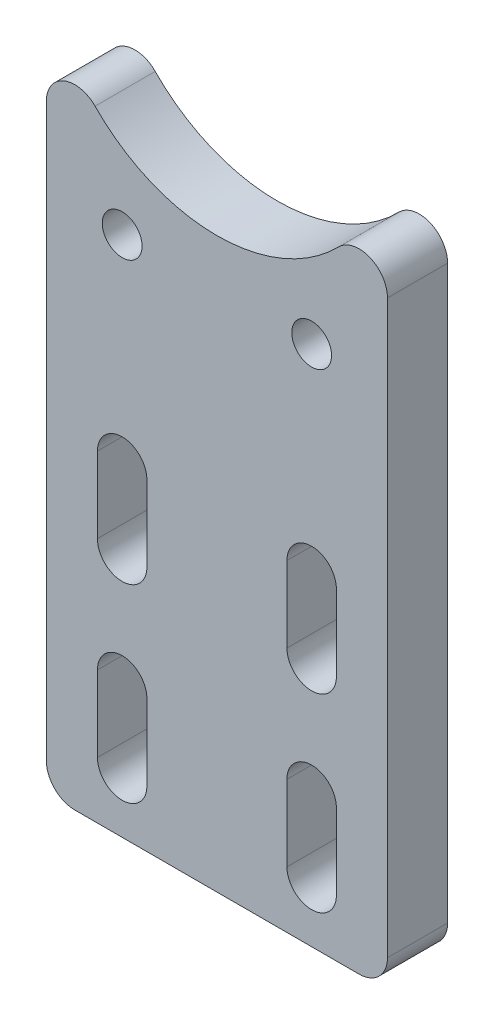
ISO-10303-21;
HEADER;
FILE_DESCRIPTION(('STEP AP214'),'2;1');
FILE_NAME('part.step','',(''),(''),'','','');
FILE_SCHEMA(('AUTOMOTIVE_DESIGN { 1 0 10303 214 1 1 1 1 }'));
ENDSEC;
DATA;
#1=APPLICATION_CONTEXT('core data for automotive mechanical design processes');
#2=APPLICATION_PROTOCOL_DEFINITION('international standard','automotive_design',2000,#1);
#3=PRODUCT_CONTEXT('',#1,'mechanical');
#4=PRODUCT('Part','Part','',(#3));
#5=PRODUCT_RELATED_PRODUCT_CATEGORY('part','',(#4));
#6=PRODUCT_DEFINITION_FORMATION('','',#4);
#7=PRODUCT_DEFINITION_CONTEXT('part definition',#1,'design');
#8=PRODUCT_DEFINITION('design','',#6,#7);
#9=PRODUCT_DEFINITION_SHAPE('','',#8);
#10=(LENGTH_UNIT() NAMED_UNIT(*) SI_UNIT(.MILLI.,.METRE.));
#11=(NAMED_UNIT(*) PLANE_ANGLE_UNIT() SI_UNIT($,.RADIAN.));
#12=(NAMED_UNIT(*) SI_UNIT($,.STERADIAN.) SOLID_ANGLE_UNIT());
#13=UNCERTAINTY_MEASURE_WITH_UNIT(LENGTH_MEASURE(1.E-05),#10,'distance_accuracy_value','');
#14=(GEOMETRIC_REPRESENTATION_CONTEXT(3) GLOBAL_UNCERTAINTY_ASSIGNED_CONTEXT((#13)) GLOBAL_UNIT_ASSIGNED_CONTEXT((#10,
#11,#12)) REPRESENTATION_CONTEXT('',''));
#15=CARTESIAN_POINT('',(0.,0.,0.));
#16=DIRECTION('',(0.,0.,1.));
#17=DIRECTION('',(1.,0.,0.));
#18=AXIS2_PLACEMENT_3D('',#15,#16,#17);
#19=CARTESIAN_POINT('',(0.,0.,6.35));
#20=DIRECTION('',(0.,0.,-1.));
#21=DIRECTION('',(-1.,0.,0.));
#22=AXIS2_PLACEMENT_3D('',#19,#20,#21);
#23=CYLINDRICAL_SURFACE('',#22,18.);
#24=CARTESIAN_POINT('',(0.,0.,6.35));
#25=DIRECTION('',(0.,0.,-1.));
#26=DIRECTION('',(1.,0.,0.));
#27=AXIS2_PLACEMENT_3D('',#24,#25,#26);
#28=CIRCLE('',#27,18.);
#29=CARTESIAN_POINT('',(12.8571428571429,-12.5973758200278,6.35));
#30=VERTEX_POINT('',#29);
#31=CARTESIAN_POINT('',(-12.8571428571429,-12.5973758200278,6.35));
#32=VERTEX_POINT('',#31);
#33=EDGE_CURVE('E346',#30,#32,#28,.T.);
#34=ORIENTED_EDGE('',*,*,#33,.F.);
#35=DIRECTION('',(0.,0.,-1.));
#36=VECTOR('',#35,1.);
#37=CARTESIAN_POINT('',(12.8571428571429,-12.5973758200278,6.35));
#38=LINE('',#37,#36);
#39=CARTESIAN_POINT('',(12.8571428571429,-12.5973758200278,0.));
#40=VERTEX_POINT('',#39);
#41=EDGE_CURVE('E13',#30,#40,#38,.T.);
#42=ORIENTED_EDGE('',*,*,#41,.T.);
#43=CARTESIAN_POINT('',(0.,0.,0.));
#44=DIRECTION('',(0.,0.,-1.));
#45=DIRECTION('',(1.,0.,0.));
#46=AXIS2_PLACEMENT_3D('',#43,#44,#45);
#47=CIRCLE('',#46,18.);
#48=CARTESIAN_POINT('',(-12.8571428571429,-12.5973758200278,0.));
#49=VERTEX_POINT('',#48);
#50=EDGE_CURVE('E345',#40,#49,#47,.T.);
#51=ORIENTED_EDGE('',*,*,#50,.T.);
#52=DIRECTION('',(0.,0.,-1.));
#53=VECTOR('',#52,1.);
#54=CARTESIAN_POINT('',(-12.8571428571429,-12.5973758200278,6.35));
#55=LINE('',#54,#53);
#56=EDGE_CURVE('E60',#49,#32,#55,.F.);
#57=ORIENTED_EDGE('',*,*,#56,.T.);
#58=EDGE_LOOP('',(#34,#42,#51,#57));
#59=FACE_BOUND('',#58,.T.);
#60=ADVANCED_FACE('F52',(#59),#23,.F.);
#61=CARTESIAN_POINT('',(-18.,0.,6.35));
#62=DIRECTION('',(1.,0.,0.));
#63=DIRECTION('',(0.,1.,0.));
#64=AXIS2_PLACEMENT_3D('',#61,#62,#63);
#65=PLANE('',#64);
#66=DIRECTION('',(0.,-1.,0.));
#67=VECTOR('',#66,1.);
#68=CARTESIAN_POINT('',(-18.,0.,0.));
#69=LINE('',#68,#67);
#70=CARTESIAN_POINT('',(-18.,-14.6969384566991,0.));
#71=VERTEX_POINT('',#70);
#72=CARTESIAN_POINT('',(-18.,-75.,0.));
#73=VERTEX_POINT('',#72);
#74=EDGE_CURVE('E362',#71,#73,#69,.T.);
#75=ORIENTED_EDGE('',*,*,#74,.T.);
#76=DIRECTION('',(0.,0.,-1.));
#77=VECTOR('',#76,1.);
#78=CARTESIAN_POINT('',(-18.,-75.,6.35));
#79=LINE('',#78,#77);
#80=CARTESIAN_POINT('',(-18.,-75.,6.35));
#81=VERTEX_POINT('',#80);
#82=EDGE_CURVE('E385',#73,#81,#79,.F.);
#83=ORIENTED_EDGE('',*,*,#82,.T.);
#84=DIRECTION('',(0.,-1.,0.));
#85=VECTOR('',#84,1.);
#86=CARTESIAN_POINT('',(-18.,0.,6.35));
#87=LINE('',#86,#85);
#88=CARTESIAN_POINT('',(-18.,-14.6969384566991,6.35));
#89=VERTEX_POINT('',#88);
#90=EDGE_CURVE('E349',#89,#81,#87,.T.);
#91=ORIENTED_EDGE('',*,*,#90,.F.);
#92=DIRECTION('',(0.,0.,-1.));
#93=VECTOR('',#92,1.);
#94=CARTESIAN_POINT('',(-18.,-14.6969384566991,6.35));
#95=LINE('',#94,#93);
#96=EDGE_CURVE('E382',#89,#71,#95,.T.);
#97=ORIENTED_EDGE('',*,*,#96,.T.);
#98=EDGE_LOOP('',(#75,#83,#91,#97));
#99=FACE_BOUND('',#98,.T.);
#100=ADVANCED_FACE('F413',(#99),#65,.F.);
#101=CARTESIAN_POINT('',(18.,-78.,6.35));
#102=DIRECTION('',(0.,1.,0.));
#103=DIRECTION('',(0.,0.,1.));
#104=AXIS2_PLACEMENT_3D('',#101,#102,#103);
#105=PLANE('',#104);
#106=DIRECTION('',(1.,0.,0.));
#107=VECTOR('',#106,1.);
#108=CARTESIAN_POINT('',(18.,-78.,6.35));
#109=LINE('',#108,#107);
#110=CARTESIAN_POINT('',(-15.,-78.,6.35));
#111=VERTEX_POINT('',#110);
#112=CARTESIAN_POINT('',(15.,-78.,6.35));
#113=VERTEX_POINT('',#112);
#114=EDGE_CURVE('E353',#111,#113,#109,.T.);
#115=ORIENTED_EDGE('',*,*,#114,.F.);
#116=DIRECTION('',(0.,0.,-1.));
#117=VECTOR('',#116,1.);
#118=CARTESIAN_POINT('',(-15.,-78.,6.35));
#119=LINE('',#118,#117);
#120=CARTESIAN_POINT('',(-15.,-78.,0.));
#121=VERTEX_POINT('',#120);
#122=EDGE_CURVE('E371',#111,#121,#119,.T.);
#123=ORIENTED_EDGE('',*,*,#122,.T.);
#124=DIRECTION('',(1.,0.,0.));
#125=VECTOR('',#124,1.);
#126=CARTESIAN_POINT('',(18.,-78.,0.));
#127=LINE('',#126,#125);
#128=CARTESIAN_POINT('',(15.,-78.,0.));
#129=VERTEX_POINT('',#128);
#130=EDGE_CURVE('E365',#121,#129,#127,.T.);
#131=ORIENTED_EDGE('',*,*,#130,.T.);
#132=DIRECTION('',(0.,0.,-1.));
#133=VECTOR('',#132,1.);
#134=CARTESIAN_POINT('',(15.,-78.,6.35));
#135=LINE('',#134,#133);
#136=EDGE_CURVE('E359',#129,#113,#135,.F.);
#137=ORIENTED_EDGE('',*,*,#136,.T.);
#138=EDGE_LOOP('',(#115,#123,#131,#137));
#139=FACE_BOUND('',#138,.T.);
#140=ADVANCED_FACE('F423',(#139),#105,.F.);
#141=CARTESIAN_POINT('',(18.,0.,6.35));
#142=DIRECTION('',(-1.,0.,0.));
#143=DIRECTION('',(0.,-1.,0.));
#144=AXIS2_PLACEMENT_3D('',#141,#142,#143);
#145=PLANE('',#144);
#146=DIRECTION('',(0.,1.,0.));
#147=VECTOR('',#146,1.);
#148=CARTESIAN_POINT('',(18.,0.,6.35));
#149=LINE('',#148,#147);
#150=CARTESIAN_POINT('',(18.,-75.,6.35));
#151=VERTEX_POINT('',#150);
#152=CARTESIAN_POINT('',(18.,-14.6969384566991,6.35));
#153=VERTEX_POINT('',#152);
#154=EDGE_CURVE('E356',#151,#153,#149,.T.);
#155=ORIENTED_EDGE('',*,*,#154,.F.);
#156=DIRECTION('',(0.,0.,-1.));
#157=VECTOR('',#156,1.);
#158=CARTESIAN_POINT('',(18.,-75.,6.35));
#159=LINE('',#158,#157);
#160=CARTESIAN_POINT('',(18.,-75.,0.));
#161=VERTEX_POINT('',#160);
#162=EDGE_CURVE('E397',#151,#161,#159,.T.);
#163=ORIENTED_EDGE('',*,*,#162,.T.);
#164=DIRECTION('',(0.,1.,0.));
#165=VECTOR('',#164,1.);
#166=CARTESIAN_POINT('',(18.,0.,0.));
#167=LINE('',#166,#165);
#168=CARTESIAN_POINT('',(18.,-14.6969384566991,0.));
#169=VERTEX_POINT('',#168);
#170=EDGE_CURVE('E350',#161,#169,#167,.T.);
#171=ORIENTED_EDGE('',*,*,#170,.T.);
#172=DIRECTION('',(0.,0.,-1.));
#173=VECTOR('',#172,1.);
#174=CARTESIAN_POINT('',(18.,-14.6969384566991,6.35));
#175=LINE('',#174,#173);
#176=EDGE_CURVE('E395',#169,#153,#175,.F.);
#177=ORIENTED_EDGE('',*,*,#176,.T.);
#178=EDGE_LOOP('',(#155,#163,#171,#177));
#179=FACE_BOUND('',#178,.T.);
#180=ADVANCED_FACE('F432',(#179),#145,.F.);
#181=CARTESIAN_POINT('',(0.,0.,6.35));
#182=DIRECTION('',(0.,0.,1.));
#183=DIRECTION('',(1.,0.,0.));
#184=AXIS2_PLACEMENT_3D('',#181,#182,#183);
#185=PLANE('',#184);
#186=CARTESIAN_POINT('',(-9.99999999999999,-22.9128784747792,6.35));
#187=DIRECTION('',(0.,0.,1.));
#188=DIRECTION('',(1.,0.,0.));
#189=AXIS2_PLACEMENT_3D('',#186,#187,#188);
#190=CIRCLE('',#189,2.1);
#191=CARTESIAN_POINT('',(-7.9,-22.9128784747792,6.35));
#192=VERTEX_POINT('',#191);
#193=EDGE_CURVE('E637',#192,#192,#190,.T.);
#194=ORIENTED_EDGE('',*,*,#193,.F.);
#195=EDGE_LOOP('',(#194));
#196=FACE_BOUND('',#195,.T.);
#197=CARTESIAN_POINT('',(9.99999999999999,-22.9128784747792,6.35));
#198=DIRECTION('',(0.,0.,1.));
#199=DIRECTION('',(1.,0.,0.));
#200=AXIS2_PLACEMENT_3D('',#197,#198,#199);
#201=CIRCLE('',#200,2.1);
#202=CARTESIAN_POINT('',(12.1,-22.9128784747792,6.35));
#203=VERTEX_POINT('',#202);
#204=EDGE_CURVE('E639',#203,#203,#201,.T.);
#205=ORIENTED_EDGE('',*,*,#204,.F.);
#206=EDGE_LOOP('',(#205));
#207=FACE_BOUND('',#206,.T.);
#208=CARTESIAN_POINT('',(-9.99999999999999,-52.,6.35));
#209=DIRECTION('',(0.,0.,1.));
#210=DIRECTION('',(1.,0.,0.));
#211=AXIS2_PLACEMENT_3D('',#208,#209,#210);
#212=CIRCLE('',#211,2.61);
#213=CARTESIAN_POINT('',(-12.61,-52.,6.35));
#214=VERTEX_POINT('',#213);
#215=CARTESIAN_POINT('',(-7.38999999999999,-52.,6.35));
#216=VERTEX_POINT('',#215);
#217=EDGE_CURVE('E67',#214,#216,#212,.T.);
#218=ORIENTED_EDGE('',*,*,#217,.F.);
#219=DIRECTION('',(0.,-1.,0.));
#220=VECTOR('',#219,1.);
#221=CARTESIAN_POINT('',(-12.61,-52.,6.35));
#222=LINE('',#221,#220);
#223=CARTESIAN_POINT('',(-12.61,-44.,6.35));
#224=VERTEX_POINT('',#223);
#225=EDGE_CURVE('E273',#224,#214,#222,.T.);
#226=ORIENTED_EDGE('',*,*,#225,.F.);
#227=CARTESIAN_POINT('',(-9.99999999999999,-44.,6.35));
#228=DIRECTION('',(0.,0.,1.));
#229=DIRECTION('',(1.,0.,0.));
#230=AXIS2_PLACEMENT_3D('',#227,#228,#229);
#231=CIRCLE('',#230,2.61);
#232=CARTESIAN_POINT('',(-7.38999999999999,-44.,6.35));
#233=VERTEX_POINT('',#232);
#234=EDGE_CURVE('E270',#233,#224,#231,.T.);
#235=ORIENTED_EDGE('',*,*,#234,.F.);
#236=DIRECTION('',(0.,1.,0.));
#237=VECTOR('',#236,1.);
#238=CARTESIAN_POINT('',(-7.38999999999999,-52.,6.35));
#239=LINE('',#238,#237);
#240=EDGE_CURVE('E267',#216,#233,#239,.T.);
#241=ORIENTED_EDGE('',*,*,#240,.F.);
#242=EDGE_LOOP('',(#218,#226,#235,#241));
#243=FACE_BOUND('',#242,.T.);
#244=CARTESIAN_POINT('',(9.99999999999999,-72.,6.35));
#245=DIRECTION('',(0.,0.,1.));
#246=DIRECTION('',(-1.,0.,0.));
#247=AXIS2_PLACEMENT_3D('',#244,#245,#246);
#248=CIRCLE('',#247,2.61);
#249=CARTESIAN_POINT('',(7.39000000000001,-72.,6.35));
#250=VERTEX_POINT('',#249);
#251=CARTESIAN_POINT('',(12.61,-72.,6.35));
#252=VERTEX_POINT('',#251);
#253=EDGE_CURVE('E75',#250,#252,#248,.T.);
#254=ORIENTED_EDGE('',*,*,#253,.F.);
#255=DIRECTION('',(0.,-1.,0.));
#256=VECTOR('',#255,1.);
#257=CARTESIAN_POINT('',(7.39000000000001,-72.,6.35));
#258=LINE('',#257,#256);
#259=CARTESIAN_POINT('',(7.39000000000001,-64.,6.35));
#260=VERTEX_POINT('',#259);
#261=EDGE_CURVE('E302',#260,#250,#258,.T.);
#262=ORIENTED_EDGE('',*,*,#261,.F.);
#263=CARTESIAN_POINT('',(10.,-64.,6.35));
#264=DIRECTION('',(0.,0.,1.));
#265=DIRECTION('',(-1.,0.,0.));
#266=AXIS2_PLACEMENT_3D('',#263,#264,#265);
#267=CIRCLE('',#266,2.61);
#268=CARTESIAN_POINT('',(12.61,-64.,6.35));
#269=VERTEX_POINT('',#268);
#270=EDGE_CURVE('E299',#269,#260,#267,.T.);
#271=ORIENTED_EDGE('',*,*,#270,.F.);
#272=DIRECTION('',(0.,1.,0.));
#273=VECTOR('',#272,1.);
#274=CARTESIAN_POINT('',(12.61,-72.,6.35));
#275=LINE('',#274,#273);
#276=EDGE_CURVE('E296',#252,#269,#275,.T.);
#277=ORIENTED_EDGE('',*,*,#276,.F.);
#278=EDGE_LOOP('',(#254,#262,#271,#277));
#279=FACE_BOUND('',#278,.T.);
#280=CARTESIAN_POINT('',(9.99999999999999,-52.,6.35));
#281=DIRECTION('',(0.,0.,1.));
#282=DIRECTION('',(-1.,0.,0.));
#283=AXIS2_PLACEMENT_3D('',#280,#281,#282);
#284=CIRCLE('',#283,2.61);
#285=CARTESIAN_POINT('',(7.38999999999999,-52.,6.35));
#286=VERTEX_POINT('',#285);
#287=CARTESIAN_POINT('',(12.61,-52.,6.35));
#288=VERTEX_POINT('',#287);
#289=EDGE_CURVE('E220',#286,#288,#284,.T.);
#290=ORIENTED_EDGE('',*,*,#289,.F.);
#291=DIRECTION('',(0.,-1.,0.));
#292=VECTOR('',#291,1.);
#293=CARTESIAN_POINT('',(7.38999999999999,-52.,6.35));
#294=LINE('',#293,#292);
#295=CARTESIAN_POINT('',(7.38999999999999,-44.,6.35));
#296=VERTEX_POINT('',#295);
#297=EDGE_CURVE('E225',#296,#286,#294,.T.);
#298=ORIENTED_EDGE('',*,*,#297,.F.);
#299=CARTESIAN_POINT('',(9.99999999999999,-44.,6.35));
#300=DIRECTION('',(0.,0.,1.));
#301=DIRECTION('',(-1.,0.,0.));
#302=AXIS2_PLACEMENT_3D('',#299,#300,#301);
#303=CIRCLE('',#302,2.61);
#304=CARTESIAN_POINT('',(12.61,-44.,6.35));
#305=VERTEX_POINT('',#304);
#306=EDGE_CURVE('E248',#305,#296,#303,.T.);
#307=ORIENTED_EDGE('',*,*,#306,.F.);
#308=DIRECTION('',(0.,1.,0.));
#309=VECTOR('',#308,1.);
#310=CARTESIAN_POINT('',(12.61,-52.,6.35));
#311=LINE('',#310,#309);
#312=EDGE_CURVE('E241',#288,#305,#311,.T.);
#313=ORIENTED_EDGE('',*,*,#312,.F.);
#314=EDGE_LOOP('',(#290,#298,#307,#313));
#315=FACE_BOUND('',#314,.T.);
#316=CARTESIAN_POINT('',(-9.99999999999999,-72.,6.35));
#317=DIRECTION('',(0.,0.,1.));
#318=DIRECTION('',(1.,0.,0.));
#319=AXIS2_PLACEMENT_3D('',#316,#317,#318);
#320=CIRCLE('',#319,2.61);
#321=CARTESIAN_POINT('',(-12.61,-72.,6.35));
#322=VERTEX_POINT('',#321);
#323=CARTESIAN_POINT('',(-7.38999999999999,-72.,6.35));
#324=VERTEX_POINT('',#323);
#325=EDGE_CURVE('E322',#322,#324,#320,.T.);
#326=ORIENTED_EDGE('',*,*,#325,.F.);
#327=DIRECTION('',(0.,-1.,0.));
#328=VECTOR('',#327,1.);
#329=CARTESIAN_POINT('',(-12.61,-72.,6.35));
#330=LINE('',#329,#328);
#331=CARTESIAN_POINT('',(-12.61,-64.,6.35));
#332=VERTEX_POINT('',#331);
#333=EDGE_CURVE('E330',#332,#322,#330,.T.);
#334=ORIENTED_EDGE('',*,*,#333,.F.);
#335=CARTESIAN_POINT('',(-9.99999999999999,-64.,6.35));
#336=DIRECTION('',(0.,0.,1.));
#337=DIRECTION('',(1.,0.,0.));
#338=AXIS2_PLACEMENT_3D('',#335,#336,#337);
#339=CIRCLE('',#338,2.61);
#340=CARTESIAN_POINT('',(-7.38999999999999,-64.,6.35));
#341=VERTEX_POINT('',#340);
#342=EDGE_CURVE('E327',#341,#332,#339,.T.);
#343=ORIENTED_EDGE('',*,*,#342,.F.);
#344=DIRECTION('',(0.,1.,0.));
#345=VECTOR('',#344,1.);
#346=CARTESIAN_POINT('',(-7.38999999999999,-72.,6.35));
#347=LINE('',#346,#345);
#348=EDGE_CURVE('E324',#324,#341,#347,.T.);
#349=ORIENTED_EDGE('',*,*,#348,.F.);
#350=EDGE_LOOP('',(#326,#334,#343,#349));
#351=FACE_BOUND('',#350,.T.);
#352=ORIENTED_EDGE('',*,*,#90,.T.);
#353=CARTESIAN_POINT('',(-15.,-75.,6.35));
#354=DIRECTION('',(0.,0.,1.));
#355=DIRECTION('',(1.,0.,0.));
#356=AXIS2_PLACEMENT_3D('',#353,#354,#355);
#357=CIRCLE('',#356,3.);
#358=EDGE_CURVE('E393',#81,#111,#357,.T.);
#359=ORIENTED_EDGE('',*,*,#358,.T.);
#360=ORIENTED_EDGE('',*,*,#114,.T.);
#361=CARTESIAN_POINT('',(15.,-75.,6.35));
#362=DIRECTION('',(0.,0.,1.));
#363=DIRECTION('',(1.,0.,0.));
#364=AXIS2_PLACEMENT_3D('',#361,#362,#363);
#365=CIRCLE('',#364,3.);
#366=EDGE_CURVE('E391',#113,#151,#365,.T.);
#367=ORIENTED_EDGE('',*,*,#366,.T.);
#368=ORIENTED_EDGE('',*,*,#154,.T.);
#369=CARTESIAN_POINT('',(15.,-14.6969384566991,6.35));
#370=DIRECTION('',(0.,0.,1.));
#371=DIRECTION('',(1.,0.,0.));
#372=AXIS2_PLACEMENT_3D('',#369,#370,#371);
#373=CIRCLE('',#372,3.);
#374=EDGE_CURVE('E389',#153,#30,#373,.T.);
#375=ORIENTED_EDGE('',*,*,#374,.T.);
#376=ORIENTED_EDGE('',*,*,#33,.T.);
#377=CARTESIAN_POINT('',(-15.,-14.6969384566991,6.35));
#378=DIRECTION('',(0.,0.,1.));
#379=DIRECTION('',(1.,0.,0.));
#380=AXIS2_PLACEMENT_3D('',#377,#378,#379);
#381=CIRCLE('',#380,3.);
#382=EDGE_CURVE('E387',#32,#89,#381,.T.);
#383=ORIENTED_EDGE('',*,*,#382,.T.);
#384=EDGE_LOOP('',(#352,#359,#360,#367,#368,#375,#376,#383));
#385=FACE_BOUND('',#384,.T.);
#386=ADVANCED_FACE('F407',(#196,#207,#243,#279,#315,#351,#385),#185,.T.);
#387=CARTESIAN_POINT('',(0.,0.,0.));
#388=DIRECTION('',(0.,0.,1.));
#389=DIRECTION('',(1.,0.,0.));
#390=AXIS2_PLACEMENT_3D('',#387,#388,#389);
#391=PLANE('',#390);
#392=CARTESIAN_POINT('',(-9.99999999999999,-22.9128784747792,0.));
#393=DIRECTION('',(0.,0.,1.));
#394=DIRECTION('',(1.,0.,0.));
#395=AXIS2_PLACEMENT_3D('',#392,#393,#394);
#396=CIRCLE('',#395,2.1);
#397=CARTESIAN_POINT('',(-7.9,-22.9128784747792,0.));
#398=VERTEX_POINT('',#397);
#399=EDGE_CURVE('E634',#398,#398,#396,.T.);
#400=ORIENTED_EDGE('',*,*,#399,.T.);
#401=EDGE_LOOP('',(#400));
#402=FACE_BOUND('',#401,.T.);
#403=CARTESIAN_POINT('',(9.99999999999999,-22.9128784747792,0.));
#404=DIRECTION('',(0.,0.,1.));
#405=DIRECTION('',(1.,0.,0.));
#406=AXIS2_PLACEMENT_3D('',#403,#404,#405);
#407=CIRCLE('',#406,2.1);
#408=CARTESIAN_POINT('',(12.1,-22.9128784747792,0.));
#409=VERTEX_POINT('',#408);
#410=EDGE_CURVE('E644',#409,#409,#407,.T.);
#411=ORIENTED_EDGE('',*,*,#410,.T.);
#412=EDGE_LOOP('',(#411));
#413=FACE_BOUND('',#412,.T.);
#414=DIRECTION('',(0.,1.,0.));
#415=VECTOR('',#414,1.);
#416=CARTESIAN_POINT('',(-12.61,-52.,0.));
#417=LINE('',#416,#415);
#418=CARTESIAN_POINT('',(-12.61,-52.,0.));
#419=VERTEX_POINT('',#418);
#420=CARTESIAN_POINT('',(-12.61,-44.,0.));
#421=VERTEX_POINT('',#420);
#422=EDGE_CURVE('E259',#419,#421,#417,.T.);
#423=ORIENTED_EDGE('',*,*,#422,.F.);
#424=CARTESIAN_POINT('',(-9.99999999999999,-52.,0.));
#425=DIRECTION('',(0.,0.,1.));
#426=DIRECTION('',(1.,0.,0.));
#427=AXIS2_PLACEMENT_3D('',#424,#425,#426);
#428=CIRCLE('',#427,2.61);
#429=CARTESIAN_POINT('',(-7.38999999999999,-52.,0.));
#430=VERTEX_POINT('',#429);
#431=EDGE_CURVE('E263',#430,#419,#428,.F.);
#432=ORIENTED_EDGE('',*,*,#431,.F.);
#433=DIRECTION('',(0.,-1.,0.));
#434=VECTOR('',#433,1.);
#435=CARTESIAN_POINT('',(-7.38999999999999,-52.,0.));
#436=LINE('',#435,#434);
#437=CARTESIAN_POINT('',(-7.38999999999999,-44.,0.));
#438=VERTEX_POINT('',#437);
#439=EDGE_CURVE('E279',#438,#430,#436,.T.);
#440=ORIENTED_EDGE('',*,*,#439,.F.);
#441=CARTESIAN_POINT('',(-9.99999999999999,-44.,0.));
#442=DIRECTION('',(0.,0.,1.));
#443=DIRECTION('',(1.,0.,0.));
#444=AXIS2_PLACEMENT_3D('',#441,#442,#443);
#445=CIRCLE('',#444,2.61);
#446=EDGE_CURVE('E257',#421,#438,#445,.F.);
#447=ORIENTED_EDGE('',*,*,#446,.F.);
#448=EDGE_LOOP('',(#423,#432,#440,#447));
#449=FACE_BOUND('',#448,.T.);
#450=DIRECTION('',(0.,1.,0.));
#451=VECTOR('',#450,1.);
#452=CARTESIAN_POINT('',(7.39000000000001,-72.,0.));
#453=LINE('',#452,#451);
#454=CARTESIAN_POINT('',(7.39000000000001,-72.,0.));
#455=VERTEX_POINT('',#454);
#456=CARTESIAN_POINT('',(7.39000000000001,-64.,0.));
#457=VERTEX_POINT('',#456);
#458=EDGE_CURVE('E289',#455,#457,#453,.T.);
#459=ORIENTED_EDGE('',*,*,#458,.F.);
#460=CARTESIAN_POINT('',(9.99999999999999,-72.,0.));
#461=DIRECTION('',(0.,0.,1.));
#462=DIRECTION('',(1.,0.,0.));
#463=AXIS2_PLACEMENT_3D('',#460,#461,#462);
#464=CIRCLE('',#463,2.61);
#465=CARTESIAN_POINT('',(12.61,-72.,0.));
#466=VERTEX_POINT('',#465);
#467=EDGE_CURVE('E292',#466,#455,#464,.F.);
#468=ORIENTED_EDGE('',*,*,#467,.F.);
#469=DIRECTION('',(0.,-1.,0.));
#470=VECTOR('',#469,1.);
#471=CARTESIAN_POINT('',(12.61,-72.,0.));
#472=LINE('',#471,#470);
#473=CARTESIAN_POINT('',(12.61,-64.,0.));
#474=VERTEX_POINT('',#473);
#475=EDGE_CURVE('E260',#474,#466,#472,.T.);
#476=ORIENTED_EDGE('',*,*,#475,.F.);
#477=CARTESIAN_POINT('',(10.,-64.,0.));
#478=DIRECTION('',(0.,0.,1.));
#479=DIRECTION('',(1.,0.,0.));
#480=AXIS2_PLACEMENT_3D('',#477,#478,#479);
#481=CIRCLE('',#480,2.61);
#482=EDGE_CURVE('E233',#457,#474,#481,.F.);
#483=ORIENTED_EDGE('',*,*,#482,.F.);
#484=EDGE_LOOP('',(#459,#468,#476,#483));
#485=FACE_BOUND('',#484,.T.);
#486=DIRECTION('',(0.,1.,0.));
#487=VECTOR('',#486,1.);
#488=CARTESIAN_POINT('',(7.38999999999999,-52.,0.));
#489=LINE('',#488,#487);
#490=CARTESIAN_POINT('',(7.38999999999999,-52.,0.));
#491=VERTEX_POINT('',#490);
#492=CARTESIAN_POINT('',(7.38999999999999,-44.,0.));
#493=VERTEX_POINT('',#492);
#494=EDGE_CURVE('E239',#491,#493,#489,.T.);
#495=ORIENTED_EDGE('',*,*,#494,.F.);
#496=CARTESIAN_POINT('',(9.99999999999999,-52.,0.));
#497=DIRECTION('',(0.,0.,1.));
#498=DIRECTION('',(1.,0.,0.));
#499=AXIS2_PLACEMENT_3D('',#496,#497,#498);
#500=CIRCLE('',#499,2.61);
#501=CARTESIAN_POINT('',(12.61,-52.,0.));
#502=VERTEX_POINT('',#501);
#503=EDGE_CURVE('E217',#502,#491,#500,.F.);
#504=ORIENTED_EDGE('',*,*,#503,.F.);
#505=DIRECTION('',(0.,-1.,0.));
#506=VECTOR('',#505,1.);
#507=CARTESIAN_POINT('',(12.61,-52.,0.));
#508=LINE('',#507,#506);
#509=CARTESIAN_POINT('',(12.61,-44.,0.));
#510=VERTEX_POINT('',#509);
#511=EDGE_CURVE('E229',#510,#502,#508,.T.);
#512=ORIENTED_EDGE('',*,*,#511,.F.);
#513=CARTESIAN_POINT('',(9.99999999999999,-44.,0.));
#514=DIRECTION('',(0.,0.,1.));
#515=DIRECTION('',(1.,0.,0.));
#516=AXIS2_PLACEMENT_3D('',#513,#514,#515);
#517=CIRCLE('',#516,2.61);
#518=EDGE_CURVE('E243',#493,#510,#517,.F.);
#519=ORIENTED_EDGE('',*,*,#518,.F.);
#520=EDGE_LOOP('',(#495,#504,#512,#519));
#521=FACE_BOUND('',#520,.T.);
#522=DIRECTION('',(0.,1.,0.));
#523=VECTOR('',#522,1.);
#524=CARTESIAN_POINT('',(-12.61,-72.,0.));
#525=LINE('',#524,#523);
#526=CARTESIAN_POINT('',(-12.61,-72.,0.));
#527=VERTEX_POINT('',#526);
#528=CARTESIAN_POINT('',(-12.61,-64.,0.));
#529=VERTEX_POINT('',#528);
#530=EDGE_CURVE('E316',#527,#529,#525,.T.);
#531=ORIENTED_EDGE('',*,*,#530,.F.);
#532=CARTESIAN_POINT('',(-9.99999999999999,-72.,0.));
#533=DIRECTION('',(0.,0.,1.));
#534=DIRECTION('',(1.,0.,0.));
#535=AXIS2_PLACEMENT_3D('',#532,#533,#534);
#536=CIRCLE('',#535,2.61);
#537=CARTESIAN_POINT('',(-7.38999999999999,-72.,0.));
#538=VERTEX_POINT('',#537);
#539=EDGE_CURVE('E319',#538,#527,#536,.F.);
#540=ORIENTED_EDGE('',*,*,#539,.F.);
#541=DIRECTION('',(0.,-1.,0.));
#542=VECTOR('',#541,1.);
#543=CARTESIAN_POINT('',(-7.38999999999999,-72.,0.));
#544=LINE('',#543,#542);
#545=CARTESIAN_POINT('',(-7.38999999999999,-64.,0.));
#546=VERTEX_POINT('',#545);
#547=EDGE_CURVE('E336',#546,#538,#544,.T.);
#548=ORIENTED_EDGE('',*,*,#547,.F.);
#549=CARTESIAN_POINT('',(-9.99999999999999,-64.,0.));
#550=DIRECTION('',(0.,0.,1.));
#551=DIRECTION('',(1.,0.,0.));
#552=AXIS2_PLACEMENT_3D('',#549,#550,#551);
#553=CIRCLE('',#552,2.61);
#554=EDGE_CURVE('E287',#529,#546,#553,.F.);
#555=ORIENTED_EDGE('',*,*,#554,.F.);
#556=EDGE_LOOP('',(#531,#540,#548,#555));
#557=FACE_BOUND('',#556,.T.);
#558=ORIENTED_EDGE('',*,*,#130,.F.);
#559=CARTESIAN_POINT('',(-15.,-75.,0.));
#560=DIRECTION('',(0.,0.,1.));
#561=DIRECTION('',(1.,0.,0.));
#562=AXIS2_PLACEMENT_3D('',#559,#560,#561);
#563=CIRCLE('',#562,3.);
#564=EDGE_CURVE('E380',#121,#73,#563,.F.);
#565=ORIENTED_EDGE('',*,*,#564,.T.);
#566=ORIENTED_EDGE('',*,*,#74,.F.);
#567=CARTESIAN_POINT('',(-15.,-14.6969384566991,0.));
#568=DIRECTION('',(0.,0.,1.));
#569=DIRECTION('',(1.,0.,0.));
#570=AXIS2_PLACEMENT_3D('',#567,#568,#569);
#571=CIRCLE('',#570,3.);
#572=EDGE_CURVE('E374',#71,#49,#571,.F.);
#573=ORIENTED_EDGE('',*,*,#572,.T.);
#574=ORIENTED_EDGE('',*,*,#50,.F.);
#575=CARTESIAN_POINT('',(15.,-14.6969384566991,0.));
#576=DIRECTION('',(0.,0.,1.));
#577=DIRECTION('',(1.,0.,0.));
#578=AXIS2_PLACEMENT_3D('',#575,#576,#577);
#579=CIRCLE('',#578,3.);
#580=EDGE_CURVE('E376',#40,#169,#579,.F.);
#581=ORIENTED_EDGE('',*,*,#580,.T.);
#582=ORIENTED_EDGE('',*,*,#170,.F.);
#583=CARTESIAN_POINT('',(15.,-75.,0.));
#584=DIRECTION('',(0.,0.,1.));
#585=DIRECTION('',(1.,0.,0.));
#586=AXIS2_PLACEMENT_3D('',#583,#584,#585);
#587=CIRCLE('',#586,3.);
#588=EDGE_CURVE('E378',#161,#129,#587,.F.);
#589=ORIENTED_EDGE('',*,*,#588,.T.);
#590=EDGE_LOOP('',(#558,#565,#566,#573,#574,#581,#582,#589));
#591=FACE_BOUND('',#590,.T.);
#592=ADVANCED_FACE('F236',(#402,#413,#449,#485,#521,#557,#591),#391,.F.);
#593=CARTESIAN_POINT('',(-15.,-75.,6.35));
#594=DIRECTION('',(0.,0.,-1.));
#595=DIRECTION('',(-1.,0.,0.));
#596=AXIS2_PLACEMENT_3D('',#593,#594,#595);
#597=CYLINDRICAL_SURFACE('',#596,3.);
#598=ORIENTED_EDGE('',*,*,#358,.F.);
#599=ORIENTED_EDGE('',*,*,#82,.F.);
#600=ORIENTED_EDGE('',*,*,#564,.F.);
#601=ORIENTED_EDGE('',*,*,#122,.F.);
#602=EDGE_LOOP('',(#598,#599,#600,#601));
#603=FACE_BOUND('',#602,.T.);
#604=ADVANCED_FACE('F420',(#603),#597,.T.);
#605=CARTESIAN_POINT('',(15.,-75.,6.35));
#606=DIRECTION('',(0.,0.,-1.));
#607=DIRECTION('',(-1.,0.,0.));
#608=AXIS2_PLACEMENT_3D('',#605,#606,#607);
#609=CYLINDRICAL_SURFACE('',#608,3.);
#610=ORIENTED_EDGE('',*,*,#366,.F.);
#611=ORIENTED_EDGE('',*,*,#136,.F.);
#612=ORIENTED_EDGE('',*,*,#588,.F.);
#613=ORIENTED_EDGE('',*,*,#162,.F.);
#614=EDGE_LOOP('',(#610,#611,#612,#613));
#615=FACE_BOUND('',#614,.T.);
#616=ADVANCED_FACE('F429',(#615),#609,.T.);
#617=CARTESIAN_POINT('',(15.,-14.6969384566991,6.35));
#618=DIRECTION('',(0.,0.,-1.));
#619=DIRECTION('',(-1.,0.,0.));
#620=AXIS2_PLACEMENT_3D('',#617,#618,#619);
#621=CYLINDRICAL_SURFACE('',#620,3.);
#622=ORIENTED_EDGE('',*,*,#374,.F.);
#623=ORIENTED_EDGE('',*,*,#176,.F.);
#624=ORIENTED_EDGE('',*,*,#580,.F.);
#625=ORIENTED_EDGE('',*,*,#41,.F.);
#626=EDGE_LOOP('',(#622,#623,#624,#625));
#627=FACE_BOUND('',#626,.T.);
#628=ADVANCED_FACE('F435',(#627),#621,.T.);
#629=CARTESIAN_POINT('',(-15.,-14.6969384566991,6.35));
#630=DIRECTION('',(0.,0.,-1.));
#631=DIRECTION('',(-1.,0.,0.));
#632=AXIS2_PLACEMENT_3D('',#629,#630,#631);
#633=CYLINDRICAL_SURFACE('',#632,3.);
#634=ORIENTED_EDGE('',*,*,#382,.F.);
#635=ORIENTED_EDGE('',*,*,#56,.F.);
#636=ORIENTED_EDGE('',*,*,#572,.F.);
#637=ORIENTED_EDGE('',*,*,#96,.F.);
#638=EDGE_LOOP('',(#634,#635,#636,#637));
#639=FACE_BOUND('',#638,.T.);
#640=ADVANCED_FACE('F54',(#639),#633,.T.);
#641=CARTESIAN_POINT('',(-9.99999999999999,-72.,-0.001000000000001));
#642=DIRECTION('',(0.,0.,1.));
#643=DIRECTION('',(1.,0.,0.));
#644=AXIS2_PLACEMENT_3D('',#641,#642,#643);
#645=CYLINDRICAL_SURFACE('',#644,2.61);
#646=ORIENTED_EDGE('',*,*,#539,.T.);
#647=DIRECTION('',(0.,0.,1.));
#648=VECTOR('',#647,1.);
#649=CARTESIAN_POINT('',(-12.61,-72.,-0.001000000000001));
#650=LINE('',#649,#648);
#651=EDGE_CURVE('E334',#527,#322,#650,.T.);
#652=ORIENTED_EDGE('',*,*,#651,.T.);
#653=ORIENTED_EDGE('',*,*,#325,.T.);
#654=DIRECTION('',(0.,0.,1.));
#655=VECTOR('',#654,1.);
#656=CARTESIAN_POINT('',(-7.38999999999999,-72.,-0.001000000000001));
#657=LINE('',#656,#655);
#658=EDGE_CURVE('E333',#538,#324,#657,.T.);
#659=ORIENTED_EDGE('',*,*,#658,.F.);
#660=EDGE_LOOP('',(#646,#652,#653,#659));
#661=FACE_BOUND('',#660,.T.);
#662=ADVANCED_FACE('F441',(#661),#645,.F.);
#663=CARTESIAN_POINT('',(-12.61,-72.,-0.001000000000001));
#664=DIRECTION('',(-1.,0.,0.));
#665=DIRECTION('',(0.,-1.,0.));
#666=AXIS2_PLACEMENT_3D('',#663,#664,#665);
#667=PLANE('',#666);
#668=ORIENTED_EDGE('',*,*,#530,.T.);
#669=DIRECTION('',(0.,0.,1.));
#670=VECTOR('',#669,1.);
#671=CARTESIAN_POINT('',(-12.61,-64.,-0.001000000000001));
#672=LINE('',#671,#670);
#673=EDGE_CURVE('E337',#529,#332,#672,.T.);
#674=ORIENTED_EDGE('',*,*,#673,.T.);
#675=ORIENTED_EDGE('',*,*,#333,.T.);
#676=ORIENTED_EDGE('',*,*,#651,.F.);
#677=EDGE_LOOP('',(#668,#674,#675,#676));
#678=FACE_BOUND('',#677,.T.);
#679=ADVANCED_FACE('F501',(#678),#667,.F.);
#680=CARTESIAN_POINT('',(-9.99999999999999,-64.,-0.001000000000001));
#681=DIRECTION('',(0.,0.,1.));
#682=DIRECTION('',(1.,0.,0.));
#683=AXIS2_PLACEMENT_3D('',#680,#681,#682);
#684=CYLINDRICAL_SURFACE('',#683,2.61);
#685=ORIENTED_EDGE('',*,*,#554,.T.);
#686=DIRECTION('',(0.,0.,1.));
#687=VECTOR('',#686,1.);
#688=CARTESIAN_POINT('',(-7.38999999999999,-64.,-0.001000000000001));
#689=LINE('',#688,#687);
#690=EDGE_CURVE('E339',#546,#341,#689,.T.);
#691=ORIENTED_EDGE('',*,*,#690,.T.);
#692=ORIENTED_EDGE('',*,*,#342,.T.);
#693=ORIENTED_EDGE('',*,*,#673,.F.);
#694=EDGE_LOOP('',(#685,#691,#692,#693));
#695=FACE_BOUND('',#694,.T.);
#696=ADVANCED_FACE('F508',(#695),#684,.F.);
#697=CARTESIAN_POINT('',(-7.38999999999999,-72.,-0.001000000000001));
#698=DIRECTION('',(1.,0.,0.));
#699=DIRECTION('',(0.,1.,0.));
#700=AXIS2_PLACEMENT_3D('',#697,#698,#699);
#701=PLANE('',#700);
#702=ORIENTED_EDGE('',*,*,#547,.T.);
#703=ORIENTED_EDGE('',*,*,#658,.T.);
#704=ORIENTED_EDGE('',*,*,#348,.T.);
#705=ORIENTED_EDGE('',*,*,#690,.F.);
#706=EDGE_LOOP('',(#702,#703,#704,#705));
#707=FACE_BOUND('',#706,.T.);
#708=ADVANCED_FACE('F516',(#707),#701,.F.);
#709=CARTESIAN_POINT('',(9.99999999999999,-52.,-0.001000000000001));
#710=DIRECTION('',(0.,0.,1.));
#711=DIRECTION('',(1.,0.,0.));
#712=AXIS2_PLACEMENT_3D('',#709,#710,#711);
#713=CYLINDRICAL_SURFACE('',#712,2.61);
#714=ORIENTED_EDGE('',*,*,#503,.T.);
#715=DIRECTION('',(0.,0.,1.));
#716=VECTOR('',#715,1.);
#717=CARTESIAN_POINT('',(7.38999999999999,-52.,-0.001000000000001));
#718=LINE('',#717,#716);
#719=EDGE_CURVE('E234',#491,#286,#718,.T.);
#720=ORIENTED_EDGE('',*,*,#719,.T.);
#721=ORIENTED_EDGE('',*,*,#289,.T.);
#722=DIRECTION('',(0.,0.,1.));
#723=VECTOR('',#722,1.);
#724=CARTESIAN_POINT('',(12.61,-52.,-0.001000000000001));
#725=LINE('',#724,#723);
#726=EDGE_CURVE('E213',#502,#288,#725,.T.);
#727=ORIENTED_EDGE('',*,*,#726,.F.);
#728=EDGE_LOOP('',(#714,#720,#721,#727));
#729=FACE_BOUND('',#728,.T.);
#730=ADVANCED_FACE('F215',(#729),#713,.F.);
#731=CARTESIAN_POINT('',(7.38999999999999,-52.,-0.001000000000001));
#732=DIRECTION('',(-1.,0.,0.));
#733=DIRECTION('',(0.,-1.,0.));
#734=AXIS2_PLACEMENT_3D('',#731,#732,#733);
#735=PLANE('',#734);
#736=ORIENTED_EDGE('',*,*,#494,.T.);
#737=DIRECTION('',(0.,0.,1.));
#738=VECTOR('',#737,1.);
#739=CARTESIAN_POINT('',(7.38999999999999,-44.,-0.001000000000001));
#740=LINE('',#739,#738);
#741=EDGE_CURVE('E254',#493,#296,#740,.T.);
#742=ORIENTED_EDGE('',*,*,#741,.T.);
#743=ORIENTED_EDGE('',*,*,#297,.T.);
#744=ORIENTED_EDGE('',*,*,#719,.F.);
#745=EDGE_LOOP('',(#736,#742,#743,#744));
#746=FACE_BOUND('',#745,.T.);
#747=ADVANCED_FACE('F531',(#746),#735,.F.);
#748=CARTESIAN_POINT('',(9.99999999999999,-44.,-0.001000000000001));
#749=DIRECTION('',(0.,0.,1.));
#750=DIRECTION('',(1.,0.,0.));
#751=AXIS2_PLACEMENT_3D('',#748,#749,#750);
#752=CYLINDRICAL_SURFACE('',#751,2.61);
#753=ORIENTED_EDGE('',*,*,#518,.T.);
#754=DIRECTION('',(0.,0.,1.));
#755=VECTOR('',#754,1.);
#756=CARTESIAN_POINT('',(12.61,-44.,-0.001000000000001));
#757=LINE('',#756,#755);
#758=EDGE_CURVE('E224',#510,#305,#757,.T.);
#759=ORIENTED_EDGE('',*,*,#758,.T.);
#760=ORIENTED_EDGE('',*,*,#306,.T.);
#761=ORIENTED_EDGE('',*,*,#741,.F.);
#762=EDGE_LOOP('',(#753,#759,#760,#761));
#763=FACE_BOUND('',#762,.T.);
#764=ADVANCED_FACE('F538',(#763),#752,.F.);
#765=CARTESIAN_POINT('',(12.61,-52.,-0.001000000000001));
#766=DIRECTION('',(1.,0.,0.));
#767=DIRECTION('',(0.,1.,0.));
#768=AXIS2_PLACEMENT_3D('',#765,#766,#767);
#769=PLANE('',#768);
#770=ORIENTED_EDGE('',*,*,#511,.T.);
#771=ORIENTED_EDGE('',*,*,#726,.T.);
#772=ORIENTED_EDGE('',*,*,#312,.T.);
#773=ORIENTED_EDGE('',*,*,#758,.F.);
#774=EDGE_LOOP('',(#770,#771,#772,#773));
#775=FACE_BOUND('',#774,.T.);
#776=ADVANCED_FACE('F230',(#775),#769,.F.);
#777=CARTESIAN_POINT('',(9.99999999999999,-72.,-0.001000000000001));
#778=DIRECTION('',(0.,0.,1.));
#779=DIRECTION('',(1.,0.,0.));
#780=AXIS2_PLACEMENT_3D('',#777,#778,#779);
#781=CYLINDRICAL_SURFACE('',#780,2.61);
#782=ORIENTED_EDGE('',*,*,#467,.T.);
#783=DIRECTION('',(0.,0.,1.));
#784=VECTOR('',#783,1.);
#785=CARTESIAN_POINT('',(7.39000000000001,-72.,-0.001000000000001));
#786=LINE('',#785,#784);
#787=EDGE_CURVE('E306',#455,#250,#786,.T.);
#788=ORIENTED_EDGE('',*,*,#787,.T.);
#789=ORIENTED_EDGE('',*,*,#253,.T.);
#790=DIRECTION('',(0.,0.,1.));
#791=VECTOR('',#790,1.);
#792=CARTESIAN_POINT('',(12.61,-72.,-0.001000000000001));
#793=LINE('',#792,#791);
#794=EDGE_CURVE('E305',#466,#252,#793,.T.);
#795=ORIENTED_EDGE('',*,*,#794,.F.);
#796=EDGE_LOOP('',(#782,#788,#789,#795));
#797=FACE_BOUND('',#796,.T.);
#798=ADVANCED_FACE('F553',(#797),#781,.F.);
#799=CARTESIAN_POINT('',(7.39000000000001,-72.,-0.001000000000001));
#800=DIRECTION('',(-1.,0.,0.));
#801=DIRECTION('',(0.,0.,1.));
#802=AXIS2_PLACEMENT_3D('',#799,#800,#801);
#803=PLANE('',#802);
#804=ORIENTED_EDGE('',*,*,#458,.T.);
#805=DIRECTION('',(0.,0.,1.));
#806=VECTOR('',#805,1.);
#807=CARTESIAN_POINT('',(7.39000000000001,-64.,-0.001000000000001));
#808=LINE('',#807,#806);
#809=EDGE_CURVE('E308',#457,#260,#808,.T.);
#810=ORIENTED_EDGE('',*,*,#809,.T.);
#811=ORIENTED_EDGE('',*,*,#261,.T.);
#812=ORIENTED_EDGE('',*,*,#787,.F.);
#813=EDGE_LOOP('',(#804,#810,#811,#812));
#814=FACE_BOUND('',#813,.T.);
#815=ADVANCED_FACE('F560',(#814),#803,.F.);
#816=CARTESIAN_POINT('',(10.,-64.,-0.001000000000001));
#817=DIRECTION('',(0.,0.,1.));
#818=DIRECTION('',(1.,0.,0.));
#819=AXIS2_PLACEMENT_3D('',#816,#817,#818);
#820=CYLINDRICAL_SURFACE('',#819,2.61);
#821=ORIENTED_EDGE('',*,*,#482,.T.);
#822=DIRECTION('',(0.,0.,1.));
#823=VECTOR('',#822,1.);
#824=CARTESIAN_POINT('',(12.61,-64.,-0.001000000000001));
#825=LINE('',#824,#823);
#826=EDGE_CURVE('E310',#474,#269,#825,.T.);
#827=ORIENTED_EDGE('',*,*,#826,.T.);
#828=ORIENTED_EDGE('',*,*,#270,.T.);
#829=ORIENTED_EDGE('',*,*,#809,.F.);
#830=EDGE_LOOP('',(#821,#827,#828,#829));
#831=FACE_BOUND('',#830,.T.);
#832=ADVANCED_FACE('F567',(#831),#820,.F.);
#833=CARTESIAN_POINT('',(12.61,-72.,-0.001000000000001));
#834=DIRECTION('',(1.,0.,0.));
#835=DIRECTION('',(0.,1.,0.));
#836=AXIS2_PLACEMENT_3D('',#833,#834,#835);
#837=PLANE('',#836);
#838=ORIENTED_EDGE('',*,*,#475,.T.);
#839=ORIENTED_EDGE('',*,*,#794,.T.);
#840=ORIENTED_EDGE('',*,*,#276,.T.);
#841=ORIENTED_EDGE('',*,*,#826,.F.);
#842=EDGE_LOOP('',(#838,#839,#840,#841));
#843=FACE_BOUND('',#842,.T.);
#844=ADVANCED_FACE('F575',(#843),#837,.F.);
#845=CARTESIAN_POINT('',(-9.99999999999999,-52.,-0.001000000000001));
#846=DIRECTION('',(0.,0.,1.));
#847=DIRECTION('',(1.,0.,0.));
#848=AXIS2_PLACEMENT_3D('',#845,#846,#847);
#849=CYLINDRICAL_SURFACE('',#848,2.61);
#850=ORIENTED_EDGE('',*,*,#431,.T.);
#851=DIRECTION('',(0.,0.,1.));
#852=VECTOR('',#851,1.);
#853=CARTESIAN_POINT('',(-12.61,-52.,-0.001000000000001));
#854=LINE('',#853,#852);
#855=EDGE_CURVE('E277',#419,#214,#854,.T.);
#856=ORIENTED_EDGE('',*,*,#855,.T.);
#857=ORIENTED_EDGE('',*,*,#217,.T.);
#858=DIRECTION('',(0.,0.,1.));
#859=VECTOR('',#858,1.);
#860=CARTESIAN_POINT('',(-7.38999999999999,-52.,-0.001000000000001));
#861=LINE('',#860,#859);
#862=EDGE_CURVE('E276',#430,#216,#861,.T.);
#863=ORIENTED_EDGE('',*,*,#862,.F.);
#864=EDGE_LOOP('',(#850,#856,#857,#863));
#865=FACE_BOUND('',#864,.T.);
#866=ADVANCED_FACE('F583',(#865),#849,.F.);
#867=CARTESIAN_POINT('',(-12.61,-52.,-0.001000000000001));
#868=DIRECTION('',(-1.,0.,0.));
#869=DIRECTION('',(0.,-1.,0.));
#870=AXIS2_PLACEMENT_3D('',#867,#868,#869);
#871=PLANE('',#870);
#872=ORIENTED_EDGE('',*,*,#422,.T.);
#873=DIRECTION('',(0.,0.,1.));
#874=VECTOR('',#873,1.);
#875=CARTESIAN_POINT('',(-12.61,-44.,-0.001000000000001));
#876=LINE('',#875,#874);
#877=EDGE_CURVE('E280',#421,#224,#876,.T.);
#878=ORIENTED_EDGE('',*,*,#877,.T.);
#879=ORIENTED_EDGE('',*,*,#225,.T.);
#880=ORIENTED_EDGE('',*,*,#855,.F.);
#881=EDGE_LOOP('',(#872,#878,#879,#880));
#882=FACE_BOUND('',#881,.T.);
#883=ADVANCED_FACE('F591',(#882),#871,.F.);
#884=CARTESIAN_POINT('',(-9.99999999999999,-44.,-0.001000000000001));
#885=DIRECTION('',(0.,0.,1.));
#886=DIRECTION('',(1.,0.,0.));
#887=AXIS2_PLACEMENT_3D('',#884,#885,#886);
#888=CYLINDRICAL_SURFACE('',#887,2.61);
#889=ORIENTED_EDGE('',*,*,#446,.T.);
#890=DIRECTION('',(0.,0.,1.));
#891=VECTOR('',#890,1.);
#892=CARTESIAN_POINT('',(-7.38999999999999,-44.,-0.001000000000001));
#893=LINE('',#892,#891);
#894=EDGE_CURVE('E282',#438,#233,#893,.T.);
#895=ORIENTED_EDGE('',*,*,#894,.T.);
#896=ORIENTED_EDGE('',*,*,#234,.T.);
#897=ORIENTED_EDGE('',*,*,#877,.F.);
#898=EDGE_LOOP('',(#889,#895,#896,#897));
#899=FACE_BOUND('',#898,.T.);
#900=ADVANCED_FACE('F598',(#899),#888,.F.);
#901=CARTESIAN_POINT('',(-7.38999999999999,-52.,-0.001000000000001));
#902=DIRECTION('',(1.,0.,0.));
#903=DIRECTION('',(0.,1.,0.));
#904=AXIS2_PLACEMENT_3D('',#901,#902,#903);
#905=PLANE('',#904);
#906=ORIENTED_EDGE('',*,*,#439,.T.);
#907=ORIENTED_EDGE('',*,*,#862,.T.);
#908=ORIENTED_EDGE('',*,*,#240,.T.);
#909=ORIENTED_EDGE('',*,*,#894,.F.);
#910=EDGE_LOOP('',(#906,#907,#908,#909));
#911=FACE_BOUND('',#910,.T.);
#912=ADVANCED_FACE('F606',(#911),#905,.F.);
#913=CARTESIAN_POINT('',(9.99999999999999,-22.9128784747792,6.35));
#914=DIRECTION('',(0.,0.,1.));
#915=DIRECTION('',(1.,0.,0.));
#916=AXIS2_PLACEMENT_3D('',#913,#914,#915);
#917=CYLINDRICAL_SURFACE('',#916,2.1);
#918=ORIENTED_EDGE('',*,*,#410,.F.);
#919=EDGE_LOOP('',(#918));
#920=FACE_BOUND('',#919,.T.);
#921=ORIENTED_EDGE('',*,*,#204,.T.);
#922=EDGE_LOOP('',(#921));
#923=FACE_BOUND('',#922,.T.);
#924=ADVANCED_FACE('F614',(#920,#923),#917,.F.);
#925=CARTESIAN_POINT('',(-9.99999999999999,-22.9128784747792,6.35));
#926=DIRECTION('',(0.,0.,1.));
#927=DIRECTION('',(1.,0.,0.));
#928=AXIS2_PLACEMENT_3D('',#925,#926,#927);
#929=CYLINDRICAL_SURFACE('',#928,2.1);
#930=ORIENTED_EDGE('',*,*,#399,.F.);
#931=EDGE_LOOP('',(#930));
#932=FACE_BOUND('',#931,.T.);
#933=ORIENTED_EDGE('',*,*,#193,.T.);
#934=EDGE_LOOP('',(#933));
#935=FACE_BOUND('',#934,.T.);
#936=ADVANCED_FACE('F622',(#932,#935),#929,.F.);
#937=CLOSED_SHELL('',(#60,#100,#140,#180,#386,#592,#604,#616,#628,#640,#662,#679,#696,#708,#730,
#747,#764,#776,#798,#815,#832,#844,#866,#883,#900,#912,#924,#936));
#938=MANIFOLD_SOLID_BREP('B2',#937);
#939=ADVANCED_BREP_SHAPE_REPRESENTATION('',(#18,#938),#14);
#940=SHAPE_DEFINITION_REPRESENTATION(#9,#939);
ENDSEC;
END-ISO-10303-21;
